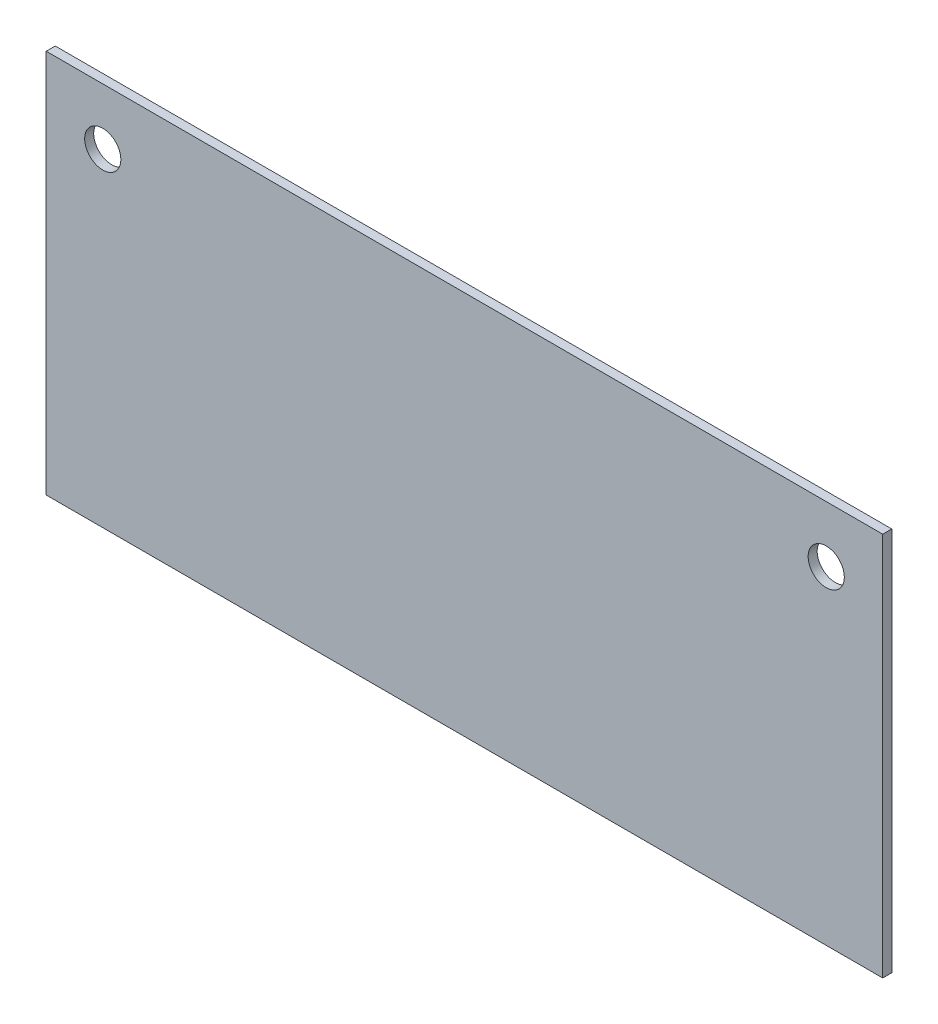
ISO-10303-21;
HEADER;
FILE_DESCRIPTION(('STEP AP214'),'2;1');
FILE_NAME('part.step','',(''),(''),'','','');
FILE_SCHEMA(('AUTOMOTIVE_DESIGN { 1 0 10303 214 1 1 1 1 }'));
ENDSEC;
DATA;
#1=APPLICATION_CONTEXT('core data for automotive mechanical design processes');
#2=APPLICATION_PROTOCOL_DEFINITION('international standard','automotive_design',2000,#1);
#3=PRODUCT_CONTEXT('',#1,'mechanical');
#4=PRODUCT('Part','Part','',(#3));
#5=PRODUCT_RELATED_PRODUCT_CATEGORY('part','',(#4));
#6=PRODUCT_DEFINITION_FORMATION('','',#4);
#7=PRODUCT_DEFINITION_CONTEXT('part definition',#1,'design');
#8=PRODUCT_DEFINITION('design','',#6,#7);
#9=PRODUCT_DEFINITION_SHAPE('','',#8);
#10=(LENGTH_UNIT() NAMED_UNIT(*) SI_UNIT(.MILLI.,.METRE.));
#11=(NAMED_UNIT(*) PLANE_ANGLE_UNIT() SI_UNIT($,.RADIAN.));
#12=(NAMED_UNIT(*) SI_UNIT($,.STERADIAN.) SOLID_ANGLE_UNIT());
#13=UNCERTAINTY_MEASURE_WITH_UNIT(LENGTH_MEASURE(1.E-05),#10,'distance_accuracy_value','');
#14=(GEOMETRIC_REPRESENTATION_CONTEXT(3) GLOBAL_UNCERTAINTY_ASSIGNED_CONTEXT((#13)) GLOBAL_UNIT_ASSIGNED_CONTEXT((#10,
#11,#12)) REPRESENTATION_CONTEXT('',''));
#15=CARTESIAN_POINT('',(0.,0.,0.));
#16=DIRECTION('',(0.,0.,1.));
#17=DIRECTION('',(1.,0.,0.));
#18=AXIS2_PLACEMENT_3D('',#15,#16,#17);
#19=CARTESIAN_POINT('',(0.,0.,0.8));
#20=DIRECTION('',(0.,0.,1.));
#21=DIRECTION('',(1.,0.,0.));
#22=AXIS2_PLACEMENT_3D('',#19,#20,#21);
#23=PLANE('',#22);
#24=CARTESIAN_POINT('',(-39.7019982310621,36.4381765219787,0.8));
#25=DIRECTION('',(0.,0.,1.));
#26=DIRECTION('',(1.,0.,0.));
#27=AXIS2_PLACEMENT_3D('',#24,#25,#26);
#28=CIRCLE('',#27,1.6);
#29=CARTESIAN_POINT('',(-38.1019982310621,36.4381765219787,0.8));
#30=VERTEX_POINT('',#29);
#31=EDGE_CURVE('E100',#30,#30,#28,.T.);
#32=ORIENTED_EDGE('',*,*,#31,.F.);
#33=EDGE_LOOP('',(#32));
#34=FACE_BOUND('',#33,.T.);
#35=DIRECTION('',(0.,-1.,0.));
#36=VECTOR('',#35,1.);
#37=CARTESIAN_POINT('',(-44.7019982310621,41.4381765219787,0.8));
#38=LINE('',#37,#36);
#39=CARTESIAN_POINT('',(-44.7019982310621,41.4381765219787,0.8));
#40=VERTEX_POINT('',#39);
#41=CARTESIAN_POINT('',(-44.7019982310621,7.43817652197867,0.8));
#42=VERTEX_POINT('',#41);
#43=EDGE_CURVE('E85',#40,#42,#38,.T.);
#44=ORIENTED_EDGE('',*,*,#43,.T.);
#45=DIRECTION('',(1.,0.,0.));
#46=VECTOR('',#45,1.);
#47=CARTESIAN_POINT('',(-44.7019982310621,7.43817652197867,0.8));
#48=LINE('',#47,#46);
#49=CARTESIAN_POINT('',(29.2980017689379,7.43817652197867,0.8));
#50=VERTEX_POINT('',#49);
#51=EDGE_CURVE('E80',#42,#50,#48,.T.);
#52=ORIENTED_EDGE('',*,*,#51,.T.);
#53=DIRECTION('',(0.,1.,0.));
#54=VECTOR('',#53,1.);
#55=CARTESIAN_POINT('',(29.2980017689379,41.4381765219787,0.8));
#56=LINE('',#55,#54);
#57=CARTESIAN_POINT('',(29.2980017689379,41.4381765219787,0.8));
#58=VERTEX_POINT('',#57);
#59=EDGE_CURVE('E83',#50,#58,#56,.T.);
#60=ORIENTED_EDGE('',*,*,#59,.T.);
#61=DIRECTION('',(-1.,0.,0.));
#62=VECTOR('',#61,1.);
#63=CARTESIAN_POINT('',(-44.7019982310621,41.4381765219787,0.8));
#64=LINE('',#63,#62);
#65=EDGE_CURVE('E50',#58,#40,#64,.T.);
#66=ORIENTED_EDGE('',*,*,#65,.T.);
#67=EDGE_LOOP('',(#44,#52,#60,#66));
#68=FACE_BOUND('',#67,.T.);
#69=CARTESIAN_POINT('',(24.2980017689379,36.4381765219787,0.8));
#70=DIRECTION('',(0.,0.,1.));
#71=DIRECTION('',(1.,0.,0.));
#72=AXIS2_PLACEMENT_3D('',#69,#70,#71);
#73=CIRCLE('',#72,1.6);
#74=CARTESIAN_POINT('',(25.8980017689379,36.4381765219787,0.8));
#75=VERTEX_POINT('',#74);
#76=EDGE_CURVE('E115',#75,#75,#73,.T.);
#77=ORIENTED_EDGE('',*,*,#76,.F.);
#78=EDGE_LOOP('',(#77));
#79=FACE_BOUND('',#78,.T.);
#80=ADVANCED_FACE('F33',(#34,#68,#79),#23,.T.);
#81=CARTESIAN_POINT('',(0.,0.,0.));
#82=DIRECTION('',(0.,0.,1.));
#83=DIRECTION('',(1.,0.,0.));
#84=AXIS2_PLACEMENT_3D('',#81,#82,#83);
#85=PLANE('',#84);
#86=CARTESIAN_POINT('',(-39.7019982310621,36.4381765219787,0.));
#87=DIRECTION('',(0.,0.,1.));
#88=DIRECTION('',(1.,0.,0.));
#89=AXIS2_PLACEMENT_3D('',#86,#87,#88);
#90=CIRCLE('',#89,1.6);
#91=CARTESIAN_POINT('',(-38.1019982310621,36.4381765219787,0.));
#92=VERTEX_POINT('',#91);
#93=EDGE_CURVE('E112',#92,#92,#90,.T.);
#94=ORIENTED_EDGE('',*,*,#93,.T.);
#95=EDGE_LOOP('',(#94));
#96=FACE_BOUND('',#95,.T.);
#97=DIRECTION('',(0.,-1.,0.));
#98=VECTOR('',#97,1.);
#99=CARTESIAN_POINT('',(-44.7019982310621,41.4381765219787,0.));
#100=LINE('',#99,#98);
#101=CARTESIAN_POINT('',(-44.7019982310621,41.4381765219787,0.));
#102=VERTEX_POINT('',#101);
#103=CARTESIAN_POINT('',(-44.7019982310621,7.43817652197867,0.));
#104=VERTEX_POINT('',#103);
#105=EDGE_CURVE('E97',#102,#104,#100,.T.);
#106=ORIENTED_EDGE('',*,*,#105,.F.);
#107=DIRECTION('',(-1.,0.,0.));
#108=VECTOR('',#107,1.);
#109=CARTESIAN_POINT('',(-44.7019982310621,41.4381765219787,0.));
#110=LINE('',#109,#108);
#111=CARTESIAN_POINT('',(29.2980017689379,41.4381765219787,0.));
#112=VERTEX_POINT('',#111);
#113=EDGE_CURVE('E73',#112,#102,#110,.T.);
#114=ORIENTED_EDGE('',*,*,#113,.F.);
#115=DIRECTION('',(0.,1.,0.));
#116=VECTOR('',#115,1.);
#117=CARTESIAN_POINT('',(29.2980017689379,41.4381765219787,0.));
#118=LINE('',#117,#116);
#119=CARTESIAN_POINT('',(29.2980017689379,7.43817652197867,0.));
#120=VERTEX_POINT('',#119);
#121=EDGE_CURVE('E67',#120,#112,#118,.T.);
#122=ORIENTED_EDGE('',*,*,#121,.F.);
#123=DIRECTION('',(1.,0.,0.));
#124=VECTOR('',#123,1.);
#125=CARTESIAN_POINT('',(-44.7019982310621,7.43817652197867,0.));
#126=LINE('',#125,#124);
#127=EDGE_CURVE('E89',#104,#120,#126,.T.);
#128=ORIENTED_EDGE('',*,*,#127,.F.);
#129=EDGE_LOOP('',(#106,#114,#122,#128));
#130=FACE_BOUND('',#129,.T.);
#131=CARTESIAN_POINT('',(24.2980017689379,36.4381765219787,0.));
#132=DIRECTION('',(0.,0.,1.));
#133=DIRECTION('',(1.,0.,0.));
#134=AXIS2_PLACEMENT_3D('',#131,#132,#133);
#135=CIRCLE('',#134,1.6);
#136=CARTESIAN_POINT('',(25.8980017689379,36.4381765219787,0.));
#137=VERTEX_POINT('',#136);
#138=EDGE_CURVE('E118',#137,#137,#135,.T.);
#139=ORIENTED_EDGE('',*,*,#138,.T.);
#140=EDGE_LOOP('',(#139));
#141=FACE_BOUND('',#140,.T.);
#142=ADVANCED_FACE('F108',(#96,#130,#141),#85,.F.);
#143=CARTESIAN_POINT('',(-44.7019982310621,41.4381765219787,0.8));
#144=DIRECTION('',(1.,0.,0.));
#145=DIRECTION('',(0.,0.,-1.));
#146=AXIS2_PLACEMENT_3D('',#143,#144,#145);
#147=PLANE('',#146);
#148=ORIENTED_EDGE('',*,*,#105,.T.);
#149=DIRECTION('',(0.,0.,-1.));
#150=VECTOR('',#149,1.);
#151=CARTESIAN_POINT('',(-44.7019982310621,7.43817652197867,0.8));
#152=LINE('',#151,#150);
#153=EDGE_CURVE('E11',#42,#104,#152,.T.);
#154=ORIENTED_EDGE('',*,*,#153,.F.);
#155=ORIENTED_EDGE('',*,*,#43,.F.);
#156=DIRECTION('',(0.,0.,-1.));
#157=VECTOR('',#156,1.);
#158=CARTESIAN_POINT('',(-44.7019982310621,41.4381765219787,0.8));
#159=LINE('',#158,#157);
#160=EDGE_CURVE('E93',#40,#102,#159,.T.);
#161=ORIENTED_EDGE('',*,*,#160,.T.);
#162=EDGE_LOOP('',(#148,#154,#155,#161));
#163=FACE_BOUND('',#162,.T.);
#164=ADVANCED_FACE('F35',(#163),#147,.F.);
#165=CARTESIAN_POINT('',(-44.7019982310621,7.43817652197867,0.8));
#166=DIRECTION('',(0.,1.,0.));
#167=DIRECTION('',(0.,0.,1.));
#168=AXIS2_PLACEMENT_3D('',#165,#166,#167);
#169=PLANE('',#168);
#170=ORIENTED_EDGE('',*,*,#127,.T.);
#171=DIRECTION('',(0.,0.,-1.));
#172=VECTOR('',#171,1.);
#173=CARTESIAN_POINT('',(29.2980017689379,7.43817652197867,0.8));
#174=LINE('',#173,#172);
#175=EDGE_CURVE('E42',#50,#120,#174,.T.);
#176=ORIENTED_EDGE('',*,*,#175,.F.);
#177=ORIENTED_EDGE('',*,*,#51,.F.);
#178=ORIENTED_EDGE('',*,*,#153,.T.);
#179=EDGE_LOOP('',(#170,#176,#177,#178));
#180=FACE_BOUND('',#179,.T.);
#181=ADVANCED_FACE('F88',(#180),#169,.F.);
#182=CARTESIAN_POINT('',(29.2980017689379,41.4381765219787,0.8));
#183=DIRECTION('',(-1.,0.,0.));
#184=DIRECTION('',(0.,-1.,0.));
#185=AXIS2_PLACEMENT_3D('',#182,#183,#184);
#186=PLANE('',#185);
#187=ORIENTED_EDGE('',*,*,#121,.T.);
#188=DIRECTION('',(0.,0.,-1.));
#189=VECTOR('',#188,1.);
#190=CARTESIAN_POINT('',(29.2980017689379,41.4381765219787,0.8));
#191=LINE('',#190,#189);
#192=EDGE_CURVE('E90',#58,#112,#191,.T.);
#193=ORIENTED_EDGE('',*,*,#192,.F.);
#194=ORIENTED_EDGE('',*,*,#59,.F.);
#195=ORIENTED_EDGE('',*,*,#175,.T.);
#196=EDGE_LOOP('',(#187,#193,#194,#195));
#197=FACE_BOUND('',#196,.T.);
#198=ADVANCED_FACE('F91',(#197),#186,.F.);
#199=CARTESIAN_POINT('',(-44.7019982310621,41.4381765219787,0.8));
#200=DIRECTION('',(0.,-1.,0.));
#201=DIRECTION('',(0.,0.,-1.));
#202=AXIS2_PLACEMENT_3D('',#199,#200,#201);
#203=PLANE('',#202);
#204=ORIENTED_EDGE('',*,*,#113,.T.);
#205=ORIENTED_EDGE('',*,*,#160,.F.);
#206=ORIENTED_EDGE('',*,*,#65,.F.);
#207=ORIENTED_EDGE('',*,*,#192,.T.);
#208=EDGE_LOOP('',(#204,#205,#206,#207));
#209=FACE_BOUND('',#208,.T.);
#210=ADVANCED_FACE('F105',(#209),#203,.F.);
#211=CARTESIAN_POINT('',(-39.7019982310621,36.4381765219787,0.8));
#212=DIRECTION('',(0.,0.,-1.));
#213=DIRECTION('',(-1.,0.,0.));
#214=AXIS2_PLACEMENT_3D('',#211,#212,#213);
#215=CYLINDRICAL_SURFACE('',#214,1.6);
#216=ORIENTED_EDGE('',*,*,#31,.T.);
#217=EDGE_LOOP('',(#216));
#218=FACE_BOUND('',#217,.T.);
#219=ORIENTED_EDGE('',*,*,#93,.F.);
#220=EDGE_LOOP('',(#219));
#221=FACE_BOUND('',#220,.T.);
#222=ADVANCED_FACE('F136',(#218,#221),#215,.F.);
#223=CARTESIAN_POINT('',(24.2980017689379,36.4381765219787,0.8));
#224=DIRECTION('',(0.,0.,-1.));
#225=DIRECTION('',(-1.,0.,0.));
#226=AXIS2_PLACEMENT_3D('',#223,#224,#225);
#227=CYLINDRICAL_SURFACE('',#226,1.6);
#228=ORIENTED_EDGE('',*,*,#76,.T.);
#229=EDGE_LOOP('',(#228));
#230=FACE_BOUND('',#229,.T.);
#231=ORIENTED_EDGE('',*,*,#138,.F.);
#232=EDGE_LOOP('',(#231));
#233=FACE_BOUND('',#232,.T.);
#234=ADVANCED_FACE('F124',(#230,#233),#227,.F.);
#235=CLOSED_SHELL('',(#80,#142,#164,#181,#198,#210,#222,#234));
#236=MANIFOLD_SOLID_BREP('B2',#235);
#237=ADVANCED_BREP_SHAPE_REPRESENTATION('',(#18,#236),#14);
#238=SHAPE_DEFINITION_REPRESENTATION(#9,#237);
ENDSEC;
END-ISO-10303-21;
